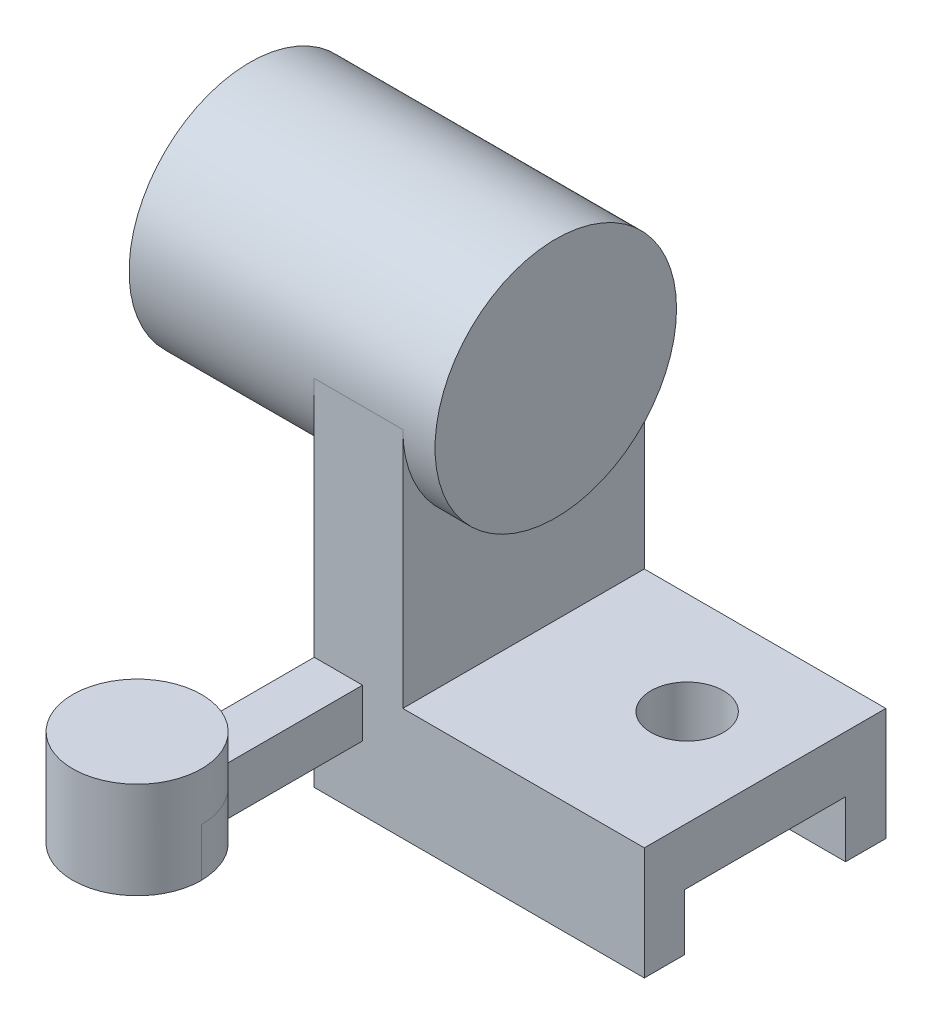
ISO-10303-21;
HEADER;
FILE_DESCRIPTION(('STEP AP214'),'2;1');
FILE_NAME('part.step','',(''),(''),'','','');
FILE_SCHEMA(('AUTOMOTIVE_DESIGN { 1 0 10303 214 1 1 1 1 }'));
ENDSEC;
DATA;
#1=APPLICATION_CONTEXT('core data for automotive mechanical design processes');
#2=APPLICATION_PROTOCOL_DEFINITION('international standard','automotive_design',2000,#1);
#3=PRODUCT_CONTEXT('',#1,'mechanical');
#4=PRODUCT('Part','Part','',(#3));
#5=PRODUCT_RELATED_PRODUCT_CATEGORY('part','',(#4));
#6=PRODUCT_DEFINITION_FORMATION('','',#4);
#7=PRODUCT_DEFINITION_CONTEXT('part definition',#1,'design');
#8=PRODUCT_DEFINITION('design','',#6,#7);
#9=PRODUCT_DEFINITION_SHAPE('','',#8);
#10=(LENGTH_UNIT() NAMED_UNIT(*) SI_UNIT(.MILLI.,.METRE.));
#11=(NAMED_UNIT(*) PLANE_ANGLE_UNIT() SI_UNIT($,.RADIAN.));
#12=(NAMED_UNIT(*) SI_UNIT($,.STERADIAN.) SOLID_ANGLE_UNIT());
#13=UNCERTAINTY_MEASURE_WITH_UNIT(LENGTH_MEASURE(1.E-05),#10,'distance_accuracy_value','');
#14=(GEOMETRIC_REPRESENTATION_CONTEXT(3) GLOBAL_UNCERTAINTY_ASSIGNED_CONTEXT((#13)) GLOBAL_UNIT_ASSIGNED_CONTEXT((#10,
#11,#12)) REPRESENTATION_CONTEXT('',''));
#15=CARTESIAN_POINT('',(0.,0.,0.));
#16=DIRECTION('',(0.,0.,1.));
#17=DIRECTION('',(1.,0.,0.));
#18=AXIS2_PLACEMENT_3D('',#15,#16,#17);
#19=CARTESIAN_POINT('',(-43.146529562982,0.,93.8817480719794));
#20=DIRECTION('',(0.,1.,0.));
#21=DIRECTION('',(-1.,0.,0.));
#22=AXIS2_PLACEMENT_3D('',#19,#20,#21);
#23=PLANE('',#22);
#24=CARTESIAN_POINT('',(-59.146529562982,0.,93.8817480719793));
#25=CARTESIAN_POINT('',(-58.6795278858251,0.,83.4094027390767));
#26=CARTESIAN_POINT('',(-49.146529562982,0.,79.0493510977881));
#27=B_SPLINE_CURVE_WITH_KNOTS('',2,(#24,#25,#26),.UNSPECIFIED.,.F.,.F.,(3,3),(0.,1.),.UNSPECIFIED.);
#28=CARTESIAN_POINT('',(-59.146529562982,0.,93.8817480719793));
#29=VERTEX_POINT('',#28);
#30=CARTESIAN_POINT('',(-56.4130287244037,0.,84.9374761619804));
#31=VERTEX_POINT('',#30);
#32=EDGE_CURVE('E171',#29,#31,#27,.T.);
#33=ORIENTED_EDGE('',*,*,#32,.F.);
#34=CARTESIAN_POINT('',(-43.146529562982,0.,93.8817480719794));
#35=DIRECTION('',(0.,1.,0.));
#36=DIRECTION('',(-1.,0.,0.));
#37=AXIS2_PLACEMENT_3D('',#34,#35,#36);
#38=CIRCLE('',#37,16.);
#39=EDGE_CURVE('E328',#31,#29,#38,.T.);
#40=ORIENTED_EDGE('',*,*,#39,.F.);
#41=EDGE_LOOP('',(#33,#40));
#42=FACE_BOUND('',#41,.T.);
#43=ADVANCED_FACE('F39',(#42),#23,.F.);
#44=CARTESIAN_POINT('',(-49.146529562982,0.,79.0493510977881));
#45=VERTEX_POINT('',#44);
#46=EDGE_CURVE('E175',#31,#45,#27,.T.);
#47=ORIENTED_EDGE('',*,*,#46,.F.);
#48=EDGE_CURVE('E327',#45,#31,#38,.T.);
#49=ORIENTED_EDGE('',*,*,#48,.F.);
#50=EDGE_LOOP('',(#47,#49));
#51=FACE_BOUND('',#50,.T.);
#52=ADVANCED_FACE('F366',(#51),#23,.F.);
#53=CARTESIAN_POINT('',(-49.146529562982,0.,0.));
#54=DIRECTION('',(-1.,0.,0.));
#55=DIRECTION('',(0.,0.,1.));
#56=AXIS2_PLACEMENT_3D('',#53,#54,#55);
#57=PLANE('',#56);
#58=DIRECTION('',(0.,0.,-1.));
#59=VECTOR('',#58,1.);
#60=CARTESIAN_POINT('',(-49.146529562982,-12.,93.8817480719794));
#61=LINE('',#60,#59);
#62=CARTESIAN_POINT('',(-49.146529562982,-12.,79.0493510977881));
#63=VERTEX_POINT('',#62);
#64=CARTESIAN_POINT('',(-49.146529562982,-12.,43.8817480719794));
#65=VERTEX_POINT('',#64);
#66=EDGE_CURVE('E163',#63,#65,#61,.T.);
#67=ORIENTED_EDGE('',*,*,#66,.F.);
#68=DIRECTION('',(0.,1.,0.));
#69=VECTOR('',#68,1.);
#70=CARTESIAN_POINT('',(-49.146529562982,-12.,79.0493510977881));
#71=LINE('',#70,#69);
#72=EDGE_CURVE('E170',#63,#45,#71,.T.);
#73=ORIENTED_EDGE('',*,*,#72,.T.);
#74=DIRECTION('',(0.,0.,-1.));
#75=VECTOR('',#74,1.);
#76=CARTESIAN_POINT('',(-49.146529562982,0.,93.8817480719794));
#77=LINE('',#76,#75);
#78=CARTESIAN_POINT('',(-49.146529562982,0.,43.8817480719794));
#79=VERTEX_POINT('',#78);
#80=EDGE_CURVE('E54',#45,#79,#77,.T.);
#81=ORIENTED_EDGE('',*,*,#80,.T.);
#82=DIRECTION('',(0.,1.,0.));
#83=VECTOR('',#82,1.);
#84=CARTESIAN_POINT('',(-49.146529562982,-28.,43.8817480719794));
#85=LINE('',#84,#83);
#86=CARTESIAN_POINT('',(-49.146529562982,60.,43.8817480719794));
#87=VERTEX_POINT('',#86);
#88=EDGE_CURVE('E222',#79,#87,#85,.T.);
#89=ORIENTED_EDGE('',*,*,#88,.T.);
#90=CARTESIAN_POINT('',(-49.146529562982,60.,13.8817480719794));
#91=DIRECTION('',(-1.,0.,0.));
#92=DIRECTION('',(0.,0.,1.));
#93=AXIS2_PLACEMENT_3D('',#90,#91,#92);
#94=CIRCLE('',#93,30.);
#95=CARTESIAN_POINT('',(-49.146529562982,60.,-16.1182519280206));
#96=VERTEX_POINT('',#95);
#97=EDGE_CURVE('E199',#96,#87,#94,.T.);
#98=ORIENTED_EDGE('',*,*,#97,.F.);
#99=DIRECTION('',(0.,-1.,0.));
#100=VECTOR('',#99,1.);
#101=CARTESIAN_POINT('',(-49.146529562982,0.,-16.1182519280206));
#102=LINE('',#101,#100);
#103=CARTESIAN_POINT('',(-49.146529562982,-28.,-16.1182519280206));
#104=VERTEX_POINT('',#103);
#105=EDGE_CURVE('E213',#96,#104,#102,.T.);
#106=ORIENTED_EDGE('',*,*,#105,.T.);
#107=DIRECTION('',(0.,0.,1.));
#108=VECTOR('',#107,1.);
#109=CARTESIAN_POINT('',(-49.146529562982,-28.,-16.1182519280206));
#110=LINE('',#109,#108);
#111=CARTESIAN_POINT('',(-49.146529562982,-28.,43.8817480719794));
#112=VERTEX_POINT('',#111);
#113=EDGE_CURVE('E220',#104,#112,#110,.T.);
#114=ORIENTED_EDGE('',*,*,#113,.T.);
#115=EDGE_CURVE('E183',#112,#65,#85,.T.);
#116=ORIENTED_EDGE('',*,*,#115,.T.);
#117=EDGE_LOOP('',(#67,#73,#81,#89,#98,#106,#114,#116));
#118=FACE_BOUND('',#117,.T.);
#119=ADVANCED_FACE('F180',(#118),#57,.T.);
#120=CARTESIAN_POINT('',(-37.146529562982,0.,79.0493510977881));
#121=CARTESIAN_POINT('',(-27.6135312401388,0.,83.4094027390768));
#122=CARTESIAN_POINT('',(-27.146529562982,0.,93.8817480719794));
#123=B_SPLINE_CURVE_WITH_KNOTS('',2,(#120,#121,#122),.UNSPECIFIED.,.F.,.F.,(3,3),(0.,1.),.UNSPECIFIED.);
#124=CARTESIAN_POINT('',(-37.146529562982,0.,79.0493510977881));
#125=VERTEX_POINT('',#124);
#126=CARTESIAN_POINT('',(-29.8800304015605,0.,84.9374761619802));
#127=VERTEX_POINT('',#126);
#128=EDGE_CURVE('E339',#125,#127,#123,.T.);
#129=ORIENTED_EDGE('',*,*,#128,.F.);
#130=EDGE_CURVE('E332',#127,#125,#38,.T.);
#131=ORIENTED_EDGE('',*,*,#130,.F.);
#132=EDGE_LOOP('',(#129,#131));
#133=FACE_BOUND('',#132,.T.);
#134=ADVANCED_FACE('F398',(#133),#23,.F.);
#135=CARTESIAN_POINT('',(-27.146529562982,0.,93.8817480719794));
#136=VERTEX_POINT('',#135);
#137=EDGE_CURVE('E177',#127,#136,#123,.T.);
#138=ORIENTED_EDGE('',*,*,#137,.F.);
#139=EDGE_CURVE('E681',#136,#127,#38,.T.);
#140=ORIENTED_EDGE('',*,*,#139,.F.);
#141=EDGE_LOOP('',(#138,#140));
#142=FACE_BOUND('',#141,.T.);
#143=ADVANCED_FACE('F368',(#142),#23,.F.);
#144=CARTESIAN_POINT('',(-37.146529562982,0.,93.8817480719794));
#145=DIRECTION('',(-1.,0.,0.));
#146=DIRECTION('',(0.,-1.,0.));
#147=AXIS2_PLACEMENT_3D('',#144,#145,#146);
#148=PLANE('',#147);
#149=DIRECTION('',(0.,1.,0.));
#150=VECTOR('',#149,1.);
#151=CARTESIAN_POINT('',(-37.146529562982,-12.,79.0493510977881));
#152=LINE('',#151,#150);
#153=CARTESIAN_POINT('',(-37.146529562982,-12.,79.0493510977881));
#154=VERTEX_POINT('',#153);
#155=EDGE_CURVE('E322',#154,#125,#152,.T.);
#156=ORIENTED_EDGE('',*,*,#155,.F.);
#157=DIRECTION('',(0.,0.,-1.));
#158=VECTOR('',#157,1.);
#159=CARTESIAN_POINT('',(-37.146529562982,-12.,93.8817480719794));
#160=LINE('',#159,#158);
#161=CARTESIAN_POINT('',(-37.146529562982,-12.,43.8817480719794));
#162=VERTEX_POINT('',#161);
#163=EDGE_CURVE('E185',#154,#162,#160,.T.);
#164=ORIENTED_EDGE('',*,*,#163,.T.);
#165=DIRECTION('',(0.,1.,0.));
#166=VECTOR('',#165,1.);
#167=CARTESIAN_POINT('',(-37.146529562982,0.,43.8817480719794));
#168=LINE('',#167,#166);
#169=CARTESIAN_POINT('',(-37.146529562982,0.,43.8817480719794));
#170=VERTEX_POINT('',#169);
#171=EDGE_CURVE('E306',#162,#170,#168,.T.);
#172=ORIENTED_EDGE('',*,*,#171,.T.);
#173=DIRECTION('',(0.,0.,-1.));
#174=VECTOR('',#173,1.);
#175=CARTESIAN_POINT('',(-37.146529562982,0.,93.8817480719794));
#176=LINE('',#175,#174);
#177=EDGE_CURVE('E190',#125,#170,#176,.T.);
#178=ORIENTED_EDGE('',*,*,#177,.F.);
#179=EDGE_LOOP('',(#156,#164,#172,#178));
#180=FACE_BOUND('',#179,.T.);
#181=ADVANCED_FACE('F320',(#180),#148,.F.);
#182=CARTESIAN_POINT('',(-27.146529562982,-28.,43.8817480719794));
#183=DIRECTION('',(0.,0.,1.));
#184=DIRECTION('',(1.,0.,0.));
#185=AXIS2_PLACEMENT_3D('',#182,#183,#184);
#186=PLANE('',#185);
#187=ORIENTED_EDGE('',*,*,#171,.F.);
#188=DIRECTION('',(1.,0.,0.));
#189=VECTOR('',#188,1.);
#190=CARTESIAN_POINT('',(-37.146529562982,-12.,43.8817480719794));
#191=LINE('',#190,#189);
#192=EDGE_CURVE('E310',#65,#162,#191,.T.);
#193=ORIENTED_EDGE('',*,*,#192,.F.);
#194=ORIENTED_EDGE('',*,*,#115,.F.);
#195=DIRECTION('',(1.,0.,0.));
#196=VECTOR('',#195,1.);
#197=CARTESIAN_POINT('',(-27.146529562982,-28.,43.8817480719794));
#198=LINE('',#197,#196);
#199=CARTESIAN_POINT('',(32.853470437018,-28.,43.8817480719794));
#200=VERTEX_POINT('',#199);
#201=EDGE_CURVE('E256',#112,#200,#198,.T.);
#202=ORIENTED_EDGE('',*,*,#201,.T.);
#203=DIRECTION('',(0.,1.,0.));
#204=VECTOR('',#203,1.);
#205=CARTESIAN_POINT('',(32.853470437018,-28.,43.8817480719794));
#206=LINE('',#205,#204);
#207=CARTESIAN_POINT('',(32.853470437018,0.,43.8817480719794));
#208=VERTEX_POINT('',#207);
#209=EDGE_CURVE('E43',#200,#208,#206,.T.);
#210=ORIENTED_EDGE('',*,*,#209,.T.);
#211=DIRECTION('',(1.,0.,0.));
#212=VECTOR('',#211,1.);
#213=CARTESIAN_POINT('',(-27.146529562982,0.,43.8817480719794));
#214=LINE('',#213,#212);
#215=CARTESIAN_POINT('',(-27.146529562982,0.,43.8817480719794));
#216=VERTEX_POINT('',#215);
#217=EDGE_CURVE('E249',#216,#208,#214,.T.);
#218=ORIENTED_EDGE('',*,*,#217,.F.);
#219=DIRECTION('',(0.,1.,0.));
#220=VECTOR('',#219,1.);
#221=CARTESIAN_POINT('',(-27.146529562982,0.,43.8817480719794));
#222=LINE('',#221,#220);
#223=CARTESIAN_POINT('',(-27.146529562982,60.,43.8817480719794));
#224=VERTEX_POINT('',#223);
#225=EDGE_CURVE('E62',#216,#224,#222,.T.);
#226=ORIENTED_EDGE('',*,*,#225,.T.);
#227=DIRECTION('',(1.,0.,0.));
#228=VECTOR('',#227,1.);
#229=CARTESIAN_POINT('',(-49.146529562982,60.,43.8817480719794));
#230=LINE('',#229,#228);
#231=EDGE_CURVE('E211',#87,#224,#230,.T.);
#232=ORIENTED_EDGE('',*,*,#231,.F.);
#233=ORIENTED_EDGE('',*,*,#88,.F.);
#234=DIRECTION('',(-1.,0.,0.));
#235=VECTOR('',#234,1.);
#236=CARTESIAN_POINT('',(-49.146529562982,0.,43.8817480719794));
#237=LINE('',#236,#235);
#238=EDGE_CURVE('E304',#170,#79,#237,.T.);
#239=ORIENTED_EDGE('',*,*,#238,.F.);
#240=EDGE_LOOP('',(#187,#193,#194,#202,#210,#218,#226,#232,#233,#239));
#241=FACE_BOUND('',#240,.T.);
#242=ADVANCED_FACE('F41',(#241),#186,.T.);
#243=CARTESIAN_POINT('',(-27.146529562982,0.,0.));
#244=DIRECTION('',(-1.,0.,0.));
#245=DIRECTION('',(0.,0.,1.));
#246=AXIS2_PLACEMENT_3D('',#243,#244,#245);
#247=PLANE('',#246);
#248=CARTESIAN_POINT('',(-27.146529562982,60.,13.8817480719794));
#249=DIRECTION('',(1.,0.,0.));
#250=DIRECTION('',(0.,0.,-1.));
#251=AXIS2_PLACEMENT_3D('',#248,#249,#250);
#252=CIRCLE('',#251,30.);
#253=CARTESIAN_POINT('',(-27.146529562982,60.,-16.1182519280206));
#254=VERTEX_POINT('',#253);
#255=EDGE_CURVE('E184',#224,#254,#252,.T.);
#256=ORIENTED_EDGE('',*,*,#255,.F.);
#257=ORIENTED_EDGE('',*,*,#225,.F.);
#258=DIRECTION('',(0.,0.,1.));
#259=VECTOR('',#258,1.);
#260=CARTESIAN_POINT('',(-27.146529562982,0.,-16.1182519280206));
#261=LINE('',#260,#259);
#262=CARTESIAN_POINT('',(-27.146529562982,0.,-16.1182519280206));
#263=VERTEX_POINT('',#262);
#264=EDGE_CURVE('E205',#263,#216,#261,.T.);
#265=ORIENTED_EDGE('',*,*,#264,.F.);
#266=DIRECTION('',(0.,-1.,0.));
#267=VECTOR('',#266,1.);
#268=CARTESIAN_POINT('',(-27.146529562982,60.,-16.1182519280206));
#269=LINE('',#268,#267);
#270=EDGE_CURVE('E202',#254,#263,#269,.T.);
#271=ORIENTED_EDGE('',*,*,#270,.F.);
#272=EDGE_LOOP('',(#256,#257,#265,#271));
#273=FACE_BOUND('',#272,.T.);
#274=ADVANCED_FACE('F282',(#273),#247,.F.);
#275=CARTESIAN_POINT('',(0.,0.,0.));
#276=DIRECTION('',(0.,1.,0.));
#277=DIRECTION('',(0.,0.,1.));
#278=AXIS2_PLACEMENT_3D('',#275,#276,#277);
#279=PLANE('',#278);
#280=CARTESIAN_POINT('',(8.85347043701799,0.,9.23783683187069));
#281=DIRECTION('',(0.,1.,0.));
#282=DIRECTION('',(0.,0.,1.));
#283=AXIS2_PLACEMENT_3D('',#280,#281,#282);
#284=CIRCLE('',#283,9.);
#285=CARTESIAN_POINT('',(8.85347043701799,0.,18.2378368318707));
#286=VERTEX_POINT('',#285);
#287=EDGE_CURVE('E217',#286,#286,#284,.T.);
#288=ORIENTED_EDGE('',*,*,#287,.F.);
#289=EDGE_LOOP('',(#288));
#290=FACE_BOUND('',#289,.T.);
#291=DIRECTION('',(-1.,0.,0.));
#292=VECTOR('',#291,1.);
#293=CARTESIAN_POINT('',(-27.146529562982,0.,-16.1182519280206));
#294=LINE('',#293,#292);
#295=CARTESIAN_POINT('',(32.853470437018,0.,-16.1182519280206));
#296=VERTEX_POINT('',#295);
#297=EDGE_CURVE('E260',#296,#263,#294,.T.);
#298=ORIENTED_EDGE('',*,*,#297,.T.);
#299=ORIENTED_EDGE('',*,*,#264,.T.);
#300=ORIENTED_EDGE('',*,*,#217,.T.);
#301=DIRECTION('',(0.,0.,-1.));
#302=VECTOR('',#301,1.);
#303=CARTESIAN_POINT('',(32.853470437018,0.,-16.1182519280206));
#304=LINE('',#303,#302);
#305=EDGE_CURVE('E267',#208,#296,#304,.T.);
#306=ORIENTED_EDGE('',*,*,#305,.T.);
#307=EDGE_LOOP('',(#298,#299,#300,#306));
#308=FACE_BOUND('',#307,.T.);
#309=ADVANCED_FACE('F273',(#290,#308),#279,.T.);
#310=CARTESIAN_POINT('',(-27.146529562982,-28.,-16.1182519280206));
#311=DIRECTION('',(0.,0.,-1.));
#312=DIRECTION('',(-1.,0.,0.));
#313=AXIS2_PLACEMENT_3D('',#310,#311,#312);
#314=PLANE('',#313);
#315=ORIENTED_EDGE('',*,*,#297,.F.);
#316=DIRECTION('',(0.,1.,0.));
#317=VECTOR('',#316,1.);
#318=CARTESIAN_POINT('',(32.853470437018,-28.,-16.1182519280206));
#319=LINE('',#318,#317);
#320=CARTESIAN_POINT('',(32.853470437018,-28.,-16.1182519280206));
#321=VERTEX_POINT('',#320);
#322=EDGE_CURVE('E11',#321,#296,#319,.T.);
#323=ORIENTED_EDGE('',*,*,#322,.F.);
#324=DIRECTION('',(-1.,0.,0.));
#325=VECTOR('',#324,1.);
#326=CARTESIAN_POINT('',(-27.146529562982,-28.,-16.1182519280206));
#327=LINE('',#326,#325);
#328=EDGE_CURVE('E264',#321,#104,#327,.T.);
#329=ORIENTED_EDGE('',*,*,#328,.T.);
#330=ORIENTED_EDGE('',*,*,#105,.F.);
#331=DIRECTION('',(1.,0.,0.));
#332=VECTOR('',#331,1.);
#333=CARTESIAN_POINT('',(-49.146529562982,60.,-16.1182519280206));
#334=LINE('',#333,#332);
#335=EDGE_CURVE('E208',#96,#254,#334,.T.);
#336=ORIENTED_EDGE('',*,*,#335,.T.);
#337=ORIENTED_EDGE('',*,*,#270,.T.);
#338=EDGE_LOOP('',(#315,#323,#329,#330,#336,#337));
#339=FACE_BOUND('',#338,.T.);
#340=ADVANCED_FACE('F278',(#339),#314,.T.);
#341=CARTESIAN_POINT('',(32.853470437018,-28.,-16.1182519280206));
#342=DIRECTION('',(1.,0.,0.));
#343=DIRECTION('',(0.,0.,-1.));
#344=AXIS2_PLACEMENT_3D('',#341,#342,#343);
#345=PLANE('',#344);
#346=DIRECTION('',(0.,-1.,0.));
#347=VECTOR('',#346,1.);
#348=CARTESIAN_POINT('',(32.853470437018,-28.,33.8817480719794));
#349=LINE('',#348,#347);
#350=CARTESIAN_POINT('',(32.853470437018,-14.,33.8817480719794));
#351=VERTEX_POINT('',#350);
#352=CARTESIAN_POINT('',(32.853470437018,-28.,33.8817480719794));
#353=VERTEX_POINT('',#352);
#354=EDGE_CURVE('E238',#351,#353,#349,.T.);
#355=ORIENTED_EDGE('',*,*,#354,.F.);
#356=DIRECTION('',(0.,0.,1.));
#357=VECTOR('',#356,1.);
#358=CARTESIAN_POINT('',(32.853470437018,-14.,33.8817480719794));
#359=LINE('',#358,#357);
#360=CARTESIAN_POINT('',(32.853470437018,-14.,-6.11825192802056));
#361=VERTEX_POINT('',#360);
#362=EDGE_CURVE('E243',#361,#351,#359,.T.);
#363=ORIENTED_EDGE('',*,*,#362,.F.);
#364=DIRECTION('',(0.,1.,0.));
#365=VECTOR('',#364,1.);
#366=CARTESIAN_POINT('',(32.853470437018,-28.,-6.11825192802056));
#367=LINE('',#366,#365);
#368=CARTESIAN_POINT('',(32.853470437018,-28.,-6.11825192802056));
#369=VERTEX_POINT('',#368);
#370=EDGE_CURVE('E240',#369,#361,#367,.T.);
#371=ORIENTED_EDGE('',*,*,#370,.F.);
#372=DIRECTION('',(0.,0.,-1.));
#373=VECTOR('',#372,1.);
#374=CARTESIAN_POINT('',(32.853470437018,-28.,-16.1182519280206));
#375=LINE('',#374,#373);
#376=EDGE_CURVE('E259',#369,#321,#375,.T.);
#377=ORIENTED_EDGE('',*,*,#376,.T.);
#378=ORIENTED_EDGE('',*,*,#322,.T.);
#379=ORIENTED_EDGE('',*,*,#305,.F.);
#380=ORIENTED_EDGE('',*,*,#209,.F.);
#381=EDGE_CURVE('E261',#200,#353,#375,.T.);
#382=ORIENTED_EDGE('',*,*,#381,.T.);
#383=EDGE_LOOP('',(#355,#363,#371,#377,#378,#379,#380,#382));
#384=FACE_BOUND('',#383,.T.);
#385=ADVANCED_FACE('F294',(#384),#345,.T.);
#386=CARTESIAN_POINT('',(0.,-28.,0.));
#387=DIRECTION('',(0.,1.,0.));
#388=DIRECTION('',(0.,0.,1.));
#389=AXIS2_PLACEMENT_3D('',#386,#387,#388);
#390=PLANE('',#389);
#391=ORIENTED_EDGE('',*,*,#376,.F.);
#392=DIRECTION('',(1.,0.,0.));
#393=VECTOR('',#392,1.);
#394=CARTESIAN_POINT('',(-27.147529562982,-28.,-6.11825192802056));
#395=LINE('',#394,#393);
#396=CARTESIAN_POINT('',(-27.146529562982,-28.,-6.11825192802056));
#397=VERTEX_POINT('',#396);
#398=EDGE_CURVE('E252',#397,#369,#395,.T.);
#399=ORIENTED_EDGE('',*,*,#398,.F.);
#400=DIRECTION('',(0.,0.,1.));
#401=VECTOR('',#400,1.);
#402=CARTESIAN_POINT('',(-27.146529562982,-28.,-16.1182519280206));
#403=LINE('',#402,#401);
#404=CARTESIAN_POINT('',(-27.146529562982,-28.,33.8817480719794));
#405=VERTEX_POINT('',#404);
#406=EDGE_CURVE('E214',#397,#405,#403,.T.);
#407=ORIENTED_EDGE('',*,*,#406,.T.);
#408=DIRECTION('',(1.,0.,0.));
#409=VECTOR('',#408,1.);
#410=CARTESIAN_POINT('',(-27.147529562982,-28.,33.8817480719794));
#411=LINE('',#410,#409);
#412=EDGE_CURVE('E246',#405,#353,#411,.T.);
#413=ORIENTED_EDGE('',*,*,#412,.T.);
#414=ORIENTED_EDGE('',*,*,#381,.F.);
#415=ORIENTED_EDGE('',*,*,#201,.F.);
#416=ORIENTED_EDGE('',*,*,#113,.F.);
#417=ORIENTED_EDGE('',*,*,#328,.F.);
#418=EDGE_LOOP('',(#391,#399,#407,#413,#414,#415,#416,#417));
#419=FACE_BOUND('',#418,.T.);
#420=ADVANCED_FACE('F300',(#419),#390,.F.);
#421=CARTESIAN_POINT('',(-27.147529562982,-28.,33.8817480719794));
#422=DIRECTION('',(0.,0.,1.));
#423=DIRECTION('',(1.,0.,0.));
#424=AXIS2_PLACEMENT_3D('',#421,#422,#423);
#425=PLANE('',#424);
#426=DIRECTION('',(1.,0.,0.));
#427=VECTOR('',#426,1.);
#428=CARTESIAN_POINT('',(-27.147529562982,-14.,33.8817480719794));
#429=LINE('',#428,#427);
#430=CARTESIAN_POINT('',(-27.146529562982,-14.,33.8817480719794));
#431=VERTEX_POINT('',#430);
#432=EDGE_CURVE('E247',#431,#351,#429,.T.);
#433=ORIENTED_EDGE('',*,*,#432,.T.);
#434=ORIENTED_EDGE('',*,*,#354,.T.);
#435=ORIENTED_EDGE('',*,*,#412,.F.);
#436=DIRECTION('',(0.,-1.,0.));
#437=VECTOR('',#436,1.);
#438=CARTESIAN_POINT('',(-27.146529562982,-28.,33.8817480719794));
#439=LINE('',#438,#437);
#440=EDGE_CURVE('E235',#431,#405,#439,.T.);
#441=ORIENTED_EDGE('',*,*,#440,.F.);
#442=EDGE_LOOP('',(#433,#434,#435,#441));
#443=FACE_BOUND('',#442,.T.);
#444=ADVANCED_FACE('F406',(#443),#425,.F.);
#445=CARTESIAN_POINT('',(-27.147529562982,-14.,33.8817480719794));
#446=DIRECTION('',(0.,1.,0.));
#447=DIRECTION('',(0.,0.,1.));
#448=AXIS2_PLACEMENT_3D('',#445,#446,#447);
#449=PLANE('',#448);
#450=CARTESIAN_POINT('',(8.85347043701799,-14.,9.23783683187069));
#451=DIRECTION('',(0.,1.,0.));
#452=DIRECTION('',(0.,0.,1.));
#453=AXIS2_PLACEMENT_3D('',#450,#451,#452);
#454=CIRCLE('',#453,9.);
#455=CARTESIAN_POINT('',(8.85347043701799,-14.,18.2378368318707));
#456=VERTEX_POINT('',#455);
#457=EDGE_CURVE('E226',#456,#456,#454,.F.);
#458=ORIENTED_EDGE('',*,*,#457,.F.);
#459=EDGE_LOOP('',(#458));
#460=FACE_BOUND('',#459,.T.);
#461=DIRECTION('',(1.,0.,0.));
#462=VECTOR('',#461,1.);
#463=CARTESIAN_POINT('',(-27.147529562982,-14.,-6.11825192802056));
#464=LINE('',#463,#462);
#465=CARTESIAN_POINT('',(-27.146529562982,-14.,-6.11825192802056));
#466=VERTEX_POINT('',#465);
#467=EDGE_CURVE('E250',#466,#361,#464,.T.);
#468=ORIENTED_EDGE('',*,*,#467,.T.);
#469=ORIENTED_EDGE('',*,*,#362,.T.);
#470=ORIENTED_EDGE('',*,*,#432,.F.);
#471=DIRECTION('',(0.,0.,1.));
#472=VECTOR('',#471,1.);
#473=CARTESIAN_POINT('',(-27.146529562982,-14.,33.8817480719794));
#474=LINE('',#473,#472);
#475=EDGE_CURVE('E232',#466,#431,#474,.T.);
#476=ORIENTED_EDGE('',*,*,#475,.F.);
#477=EDGE_LOOP('',(#468,#469,#470,#476));
#478=FACE_BOUND('',#477,.T.);
#479=ADVANCED_FACE('F403',(#460,#478),#449,.F.);
#480=CARTESIAN_POINT('',(-27.147529562982,-28.,-6.11825192802056));
#481=DIRECTION('',(0.,0.,-1.));
#482=DIRECTION('',(-1.,0.,0.));
#483=AXIS2_PLACEMENT_3D('',#480,#481,#482);
#484=PLANE('',#483);
#485=ORIENTED_EDGE('',*,*,#398,.T.);
#486=ORIENTED_EDGE('',*,*,#370,.T.);
#487=ORIENTED_EDGE('',*,*,#467,.F.);
#488=DIRECTION('',(0.,1.,0.));
#489=VECTOR('',#488,1.);
#490=CARTESIAN_POINT('',(-27.146529562982,-28.,-6.11825192802056));
#491=LINE('',#490,#489);
#492=EDGE_CURVE('E229',#397,#466,#491,.T.);
#493=ORIENTED_EDGE('',*,*,#492,.F.);
#494=EDGE_LOOP('',(#485,#486,#487,#493));
#495=FACE_BOUND('',#494,.T.);
#496=ADVANCED_FACE('F401',(#495),#484,.F.);
#497=CARTESIAN_POINT('',(8.85347043701799,-28.001,9.23783683187069));
#498=DIRECTION('',(0.,1.,0.));
#499=DIRECTION('',(0.,0.,1.));
#500=AXIS2_PLACEMENT_3D('',#497,#498,#499);
#501=CYLINDRICAL_SURFACE('',#500,9.);
#502=ORIENTED_EDGE('',*,*,#287,.T.);
#503=EDGE_LOOP('',(#502));
#504=FACE_BOUND('',#503,.T.);
#505=ORIENTED_EDGE('',*,*,#457,.T.);
#506=EDGE_LOOP('',(#505));
#507=FACE_BOUND('',#506,.T.);
#508=ADVANCED_FACE('F394',(#504,#507),#501,.F.);
#509=CARTESIAN_POINT('',(-27.146529562982,0.,0.));
#510=DIRECTION('',(-1.,0.,0.));
#511=DIRECTION('',(0.,0.,1.));
#512=AXIS2_PLACEMENT_3D('',#509,#510,#511);
#513=PLANE('',#512);
#514=ORIENTED_EDGE('',*,*,#475,.T.);
#515=ORIENTED_EDGE('',*,*,#440,.T.);
#516=ORIENTED_EDGE('',*,*,#406,.F.);
#517=ORIENTED_EDGE('',*,*,#492,.T.);
#518=EDGE_LOOP('',(#514,#515,#516,#517));
#519=FACE_BOUND('',#518,.T.);
#520=ADVANCED_FACE('F388',(#519),#513,.F.);
#521=CARTESIAN_POINT('',(-95.146529562982,60.,13.8817480719795));
#522=DIRECTION('',(1.,0.,0.));
#523=DIRECTION('',(0.,0.,-1.));
#524=AXIS2_PLACEMENT_3D('',#521,#522,#523);
#525=CYLINDRICAL_SURFACE('',#524,30.);
#526=CARTESIAN_POINT('',(-95.146529562982,60.,13.8817480719795));
#527=DIRECTION('',(1.,0.,0.));
#528=DIRECTION('',(0.,0.,-1.));
#529=AXIS2_PLACEMENT_3D('',#526,#527,#528);
#530=CIRCLE('',#529,30.);
#531=CARTESIAN_POINT('',(-95.146529562982,60.,-16.1182519280205));
#532=VERTEX_POINT('',#531);
#533=EDGE_CURVE('E195',#532,#532,#530,.T.);
#534=ORIENTED_EDGE('',*,*,#533,.T.);
#535=EDGE_LOOP('',(#534));
#536=FACE_BOUND('',#535,.T.);
#537=ORIENTED_EDGE('',*,*,#335,.F.);
#538=ORIENTED_EDGE('',*,*,#97,.T.);
#539=ORIENTED_EDGE('',*,*,#231,.T.);
#540=ORIENTED_EDGE('',*,*,#255,.T.);
#541=EDGE_LOOP('',(#537,#538,#539,#540));
#542=FACE_BOUND('',#541,.T.);
#543=CARTESIAN_POINT('',(-19.146529562982,60.,13.8817480719794));
#544=DIRECTION('',(1.,0.,0.));
#545=DIRECTION('',(0.,0.,-1.));
#546=AXIS2_PLACEMENT_3D('',#543,#544,#545);
#547=CIRCLE('',#546,30.);
#548=CARTESIAN_POINT('',(-19.146529562982,60.,-16.1182519280206));
#549=VERTEX_POINT('',#548);
#550=EDGE_CURVE('E188',#549,#549,#547,.T.);
#551=ORIENTED_EDGE('',*,*,#550,.F.);
#552=EDGE_LOOP('',(#551));
#553=FACE_BOUND('',#552,.T.);
#554=ADVANCED_FACE('F284',(#536,#542,#553),#525,.T.);
#555=CARTESIAN_POINT('',(-95.146529562982,60.,13.8817480719795));
#556=DIRECTION('',(1.,0.,0.));
#557=DIRECTION('',(0.,0.,-1.));
#558=AXIS2_PLACEMENT_3D('',#555,#556,#557);
#559=PLANE('',#558);
#560=ORIENTED_EDGE('',*,*,#533,.F.);
#561=EDGE_LOOP('',(#560));
#562=FACE_BOUND('',#561,.T.);
#563=ADVANCED_FACE('F381',(#562),#559,.F.);
#564=CARTESIAN_POINT('',(-19.146529562982,60.,13.8817480719794));
#565=DIRECTION('',(1.,0.,0.));
#566=DIRECTION('',(0.,0.,-1.));
#567=AXIS2_PLACEMENT_3D('',#564,#565,#566);
#568=PLANE('',#567);
#569=ORIENTED_EDGE('',*,*,#550,.T.);
#570=EDGE_LOOP('',(#569));
#571=FACE_BOUND('',#570,.T.);
#572=ADVANCED_FACE('F378',(#571),#568,.T.);
#573=CARTESIAN_POINT('',(-37.146529562982,-12.,93.8817480719794));
#574=DIRECTION('',(0.,1.,0.));
#575=DIRECTION('',(0.,0.,1.));
#576=AXIS2_PLACEMENT_3D('',#573,#574,#575);
#577=PLANE('',#576);
#578=CARTESIAN_POINT('',(-59.146529562982,-12.,93.8817480719793));
#579=CARTESIAN_POINT('',(-58.6795278858251,-12.,83.4094027390767));
#580=CARTESIAN_POINT('',(-49.146529562982,-12.,79.0493510977881));
#581=B_SPLINE_CURVE_WITH_KNOTS('',2,(#578,#579,#580),.UNSPECIFIED.,.F.,.F.,(3,3),(0.,1.),.UNSPECIFIED.);
#582=CARTESIAN_POINT('',(-59.146529562982,-12.,93.8817480719793));
#583=VERTEX_POINT('',#582);
#584=EDGE_CURVE('E158',#583,#63,#581,.T.);
#585=ORIENTED_EDGE('',*,*,#584,.T.);
#586=ORIENTED_EDGE('',*,*,#66,.T.);
#587=ORIENTED_EDGE('',*,*,#192,.T.);
#588=ORIENTED_EDGE('',*,*,#163,.F.);
#589=CARTESIAN_POINT('',(-37.146529562982,-12.,79.0493510977881));
#590=CARTESIAN_POINT('',(-27.6135312401388,-12.,83.4094027390768));
#591=CARTESIAN_POINT('',(-27.146529562982,-12.,93.8817480719794));
#592=B_SPLINE_CURVE_WITH_KNOTS('',2,(#589,#590,#591),.UNSPECIFIED.,.F.,.F.,(3,3),(0.,1.),.UNSPECIFIED.);
#593=CARTESIAN_POINT('',(-27.146529562982,-12.,93.8817480719794));
#594=VERTEX_POINT('',#593);
#595=EDGE_CURVE('E338',#154,#594,#592,.T.);
#596=ORIENTED_EDGE('',*,*,#595,.T.);
#597=CARTESIAN_POINT('',(-43.146529562982,-12.,93.8817480719794));
#598=DIRECTION('',(0.,-1.,0.));
#599=DIRECTION('',(1.,0.,0.));
#600=AXIS2_PLACEMENT_3D('',#597,#598,#599);
#601=CIRCLE('',#600,16.);
#602=EDGE_CURVE('E167',#594,#583,#601,.T.);
#603=ORIENTED_EDGE('',*,*,#602,.T.);
#604=EDGE_LOOP('',(#585,#586,#587,#588,#596,#603));
#605=FACE_BOUND('',#604,.T.);
#606=ADVANCED_FACE('F160',(#605),#577,.F.);
#607=CARTESIAN_POINT('',(-49.146529562982,0.,93.8817480719794));
#608=DIRECTION('',(0.,-1.,0.));
#609=DIRECTION('',(1.,0.,0.));
#610=AXIS2_PLACEMENT_3D('',#607,#608,#609);
#611=PLANE('',#610);
#612=EDGE_CURVE('E317',#125,#45,#38,.T.);
#613=ORIENTED_EDGE('',*,*,#612,.F.);
#614=ORIENTED_EDGE('',*,*,#177,.T.);
#615=ORIENTED_EDGE('',*,*,#238,.T.);
#616=ORIENTED_EDGE('',*,*,#80,.F.);
#617=EDGE_LOOP('',(#613,#614,#615,#616));
#618=FACE_BOUND('',#617,.T.);
#619=ADVANCED_FACE('F315',(#618),#611,.F.);
#620=CARTESIAN_POINT('',(-43.146529562982,12.,93.8817480719794));
#621=DIRECTION('',(0.,-1.,0.));
#622=DIRECTION('',(1.,0.,0.));
#623=AXIS2_PLACEMENT_3D('',#620,#621,#622);
#624=CYLINDRICAL_SURFACE('',#623,16.);
#625=CARTESIAN_POINT('',(-43.146529562982,12.,93.8817480719794));
#626=DIRECTION('',(0.,1.,0.));
#627=DIRECTION('',(-1.,0.,0.));
#628=AXIS2_PLACEMENT_3D('',#625,#626,#627);
#629=CIRCLE('',#628,16.);
#630=CARTESIAN_POINT('',(-59.146529562982,12.,93.8817480719794));
#631=VERTEX_POINT('',#630);
#632=EDGE_CURVE('E323',#631,#631,#629,.T.);
#633=ORIENTED_EDGE('',*,*,#632,.F.);
#634=EDGE_LOOP('',(#633));
#635=FACE_BOUND('',#634,.T.);
#636=ORIENTED_EDGE('',*,*,#612,.T.);
#637=ORIENTED_EDGE('',*,*,#48,.T.);
#638=ORIENTED_EDGE('',*,*,#39,.T.);
#639=DIRECTION('',(0.,1.,0.));
#640=VECTOR('',#639,1.);
#641=CARTESIAN_POINT('',(-59.146529562982,-12.,93.8817480719793));
#642=LINE('',#641,#640);
#643=EDGE_CURVE('E330',#583,#29,#642,.T.);
#644=ORIENTED_EDGE('',*,*,#643,.F.);
#645=ORIENTED_EDGE('',*,*,#602,.F.);
#646=DIRECTION('',(0.,1.,0.));
#647=VECTOR('',#646,1.);
#648=CARTESIAN_POINT('',(-27.146529562982,-12.,93.8817480719794));
#649=LINE('',#648,#647);
#650=EDGE_CURVE('E333',#594,#136,#649,.T.);
#651=ORIENTED_EDGE('',*,*,#650,.T.);
#652=ORIENTED_EDGE('',*,*,#139,.T.);
#653=ORIENTED_EDGE('',*,*,#130,.T.);
#654=EDGE_LOOP('',(#636,#637,#638,#644,#645,#651,#652,#653));
#655=FACE_BOUND('',#654,.T.);
#656=ADVANCED_FACE('F362',(#635,#655),#624,.T.);
#657=CARTESIAN_POINT('',(-43.146529562982,12.,93.8817480719794));
#658=DIRECTION('',(0.,1.,0.));
#659=DIRECTION('',(-1.,0.,0.));
#660=AXIS2_PLACEMENT_3D('',#657,#658,#659);
#661=PLANE('',#660);
#662=ORIENTED_EDGE('',*,*,#632,.T.);
#663=EDGE_LOOP('',(#662));
#664=FACE_BOUND('',#663,.T.);
#665=ADVANCED_FACE('F358',(#664),#661,.T.);
#666=DIRECTION('',(0.,1.,0.));
#667=VECTOR('',#666,1.);
#668=SURFACE_OF_LINEAR_EXTRUSION('',#592,#667);
#669=ORIENTED_EDGE('',*,*,#128,.T.);
#670=ORIENTED_EDGE('',*,*,#137,.T.);
#671=ORIENTED_EDGE('',*,*,#650,.F.);
#672=ORIENTED_EDGE('',*,*,#595,.F.);
#673=ORIENTED_EDGE('',*,*,#155,.T.);
#674=EDGE_LOOP('',(#669,#670,#671,#672,#673));
#675=FACE_BOUND('',#674,.T.);
#676=ADVANCED_FACE('F354',(#675),#668,.F.);
#677=DIRECTION('',(0.,1.,0.));
#678=VECTOR('',#677,1.);
#679=SURFACE_OF_LINEAR_EXTRUSION('',#581,#678);
#680=ORIENTED_EDGE('',*,*,#32,.T.);
#681=ORIENTED_EDGE('',*,*,#46,.T.);
#682=ORIENTED_EDGE('',*,*,#72,.F.);
#683=ORIENTED_EDGE('',*,*,#584,.F.);
#684=ORIENTED_EDGE('',*,*,#643,.T.);
#685=EDGE_LOOP('',(#680,#681,#682,#683,#684));
#686=FACE_BOUND('',#685,.T.);
#687=ADVANCED_FACE('F173',(#686),#679,.F.);
#688=CLOSED_SHELL('',(#43,#52,#119,#134,#143,#181,#242,#274,#309,#340,#385,#420,#444,#479,#496,
#508,#520,#554,#563,#572,#606,#619,#656,#665,#676,#687));
#689=MANIFOLD_SOLID_BREP('B2',#688);
#690=ADVANCED_BREP_SHAPE_REPRESENTATION('',(#18,#689),#14);
#691=SHAPE_DEFINITION_REPRESENTATION(#9,#690);
ENDSEC;
END-ISO-10303-21;
